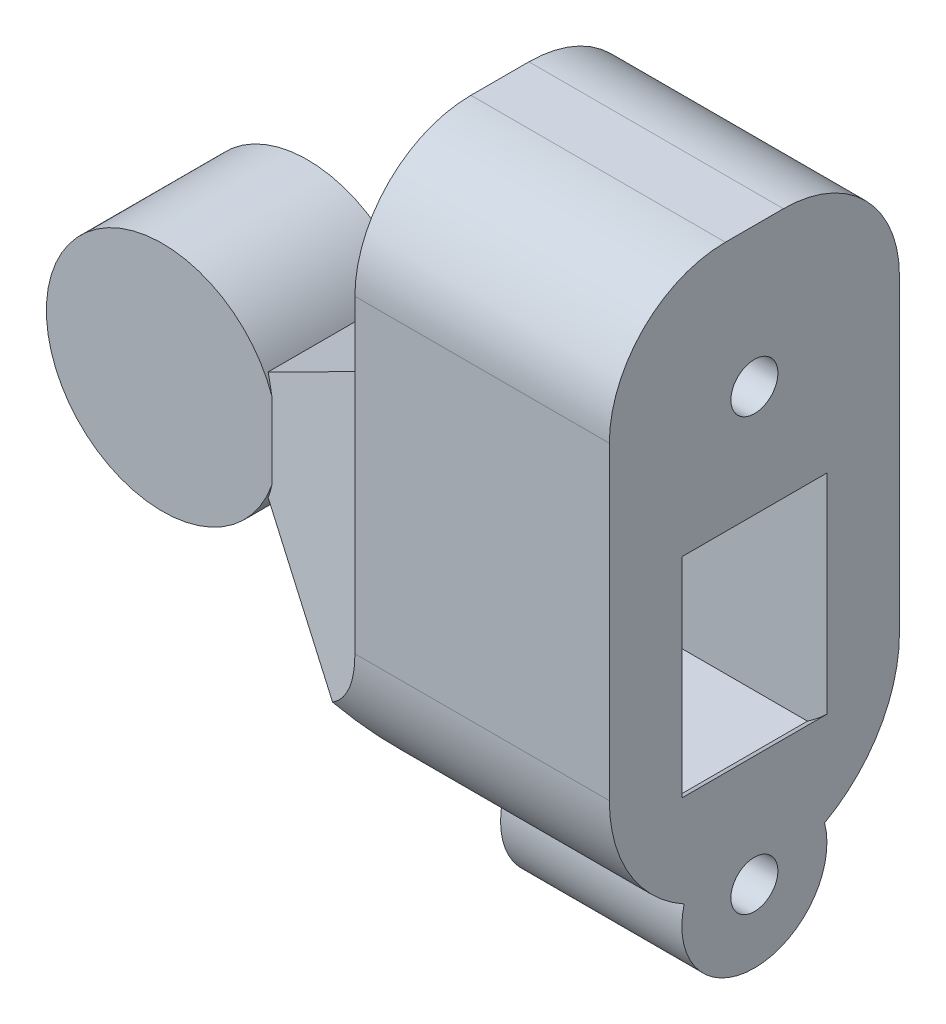
ISO-10303-21;
HEADER;
FILE_DESCRIPTION(('STEP AP214'),'2;1');
FILE_NAME('part.step','',(''),(''),'','','');
FILE_SCHEMA(('AUTOMOTIVE_DESIGN { 1 0 10303 214 1 1 1 1 }'));
ENDSEC;
DATA;
#1=APPLICATION_CONTEXT('core data for automotive mechanical design processes');
#2=APPLICATION_PROTOCOL_DEFINITION('international standard','automotive_design',2000,#1);
#3=PRODUCT_CONTEXT('',#1,'mechanical');
#4=PRODUCT('Part','Part','',(#3));
#5=PRODUCT_RELATED_PRODUCT_CATEGORY('part','',(#4));
#6=PRODUCT_DEFINITION_FORMATION('','',#4);
#7=PRODUCT_DEFINITION_CONTEXT('part definition',#1,'design');
#8=PRODUCT_DEFINITION('design','',#6,#7);
#9=PRODUCT_DEFINITION_SHAPE('','',#8);
#10=(LENGTH_UNIT() NAMED_UNIT(*) SI_UNIT(.MILLI.,.METRE.));
#11=(NAMED_UNIT(*) PLANE_ANGLE_UNIT() SI_UNIT($,.RADIAN.));
#12=(NAMED_UNIT(*) SI_UNIT($,.STERADIAN.) SOLID_ANGLE_UNIT());
#13=UNCERTAINTY_MEASURE_WITH_UNIT(LENGTH_MEASURE(1.E-05),#10,'distance_accuracy_value','');
#14=(GEOMETRIC_REPRESENTATION_CONTEXT(3) GLOBAL_UNCERTAINTY_ASSIGNED_CONTEXT((#13)) GLOBAL_UNIT_ASSIGNED_CONTEXT((#10,
#11,#12)) REPRESENTATION_CONTEXT('',''));
#15=CARTESIAN_POINT('',(0.,0.,0.));
#16=DIRECTION('',(0.,0.,1.));
#17=DIRECTION('',(1.,0.,0.));
#18=AXIS2_PLACEMENT_3D('',#15,#16,#17);
#19=CARTESIAN_POINT('',(22.7400393390537,-3.0875,3.175));
#20=DIRECTION('',(-1.,0.,0.));
#21=DIRECTION('',(0.,0.,1.));
#22=AXIS2_PLACEMENT_3D('',#19,#20,#21);
#23=CYLINDRICAL_SURFACE('',#22,6.35);
#24=CARTESIAN_POINT('',(5.448805756088,-3.0875,3.175));
#25=DIRECTION('',(-0.591996367950185,-0.805940630774866,0.));
#26=DIRECTION('',(-0.805940630774866,0.591996367950185,0.));
#27=AXIS2_PLACEMENT_3D('',#24,#25,#26);
#28=ELLIPSE('',#27,10.7264171602727,6.35);
#29=CARTESIAN_POINT('',(13.0130542416795,-8.64375,6.24918053105214));
#30=VERTEX_POINT('',#29);
#31=CARTESIAN_POINT('',(9.77315645377781,-6.26391251603598,8.6734455556066));
#32=VERTEX_POINT('',#31);
#33=EDGE_CURVE('E270',#30,#32,#28,.T.);
#34=ORIENTED_EDGE('',*,*,#33,.F.);
#35=DIRECTION('',(1.,0.,0.));
#36=VECTOR('',#35,1.);
#37=CARTESIAN_POINT('',(4.86126966952685,-8.64375,6.24918053105214));
#38=LINE('',#37,#36);
#39=CARTESIAN_POINT('',(14.8025393390537,-8.64375,6.24918053105214));
#40=VERTEX_POINT('',#39);
#41=EDGE_CURVE('E254',#30,#40,#38,.T.);
#42=ORIENTED_EDGE('',*,*,#41,.T.);
#43=DIRECTION('',(1.,0.,0.));
#44=VECTOR('',#43,1.);
#45=CARTESIAN_POINT('',(14.8025393390537,-8.64375,6.24918053105214));
#46=LINE('',#45,#44);
#47=CARTESIAN_POINT('',(22.7400393390537,-8.64375,6.24918053105214));
#48=VERTEX_POINT('',#47);
#49=EDGE_CURVE('E268',#40,#48,#46,.T.);
#50=ORIENTED_EDGE('',*,*,#49,.T.);
#51=CARTESIAN_POINT('',(22.7400393390537,-3.0875,3.175));
#52=DIRECTION('',(-1.,0.,0.));
#53=DIRECTION('',(0.,-1.,0.));
#54=AXIS2_PLACEMENT_3D('',#51,#52,#53);
#55=CIRCLE('',#54,6.35);
#56=CARTESIAN_POINT('',(22.7400393390537,-3.0875,9.525));
#57=VERTEX_POINT('',#56);
#58=EDGE_CURVE('E403',#57,#48,#55,.F.);
#59=ORIENTED_EDGE('',*,*,#58,.F.);
#60=DIRECTION('',(-1.,0.,0.));
#61=VECTOR('',#60,1.);
#62=CARTESIAN_POINT('',(0.,-3.0875,9.525));
#63=LINE('',#62,#61);
#64=CARTESIAN_POINT('',(11.5993208529701,-3.0875,9.525));
#65=VERTEX_POINT('',#64);
#66=EDGE_CURVE('E400',#65,#57,#63,.F.);
#67=ORIENTED_EDGE('',*,*,#66,.F.);
#68=CARTESIAN_POINT('',(-2.01829809226535,-3.0875,3.175));
#69=DIRECTION('',(-0.422618261740706,0.,0.906307787036647));
#70=DIRECTION('',(-0.906307787036647,0.,-0.422618261740706));
#71=AXIS2_PLACEMENT_3D('',#68,#69,#70);
#72=ELLIPSE('',#71,15.0253800530181,6.35);
#73=EDGE_CURVE('E432',#65,#32,#72,.F.);
#74=ORIENTED_EDGE('',*,*,#73,.T.);
#75=EDGE_LOOP('',(#34,#42,#50,#59,#67,#74));
#76=FACE_BOUND('',#75,.T.);
#77=ADVANCED_FACE('F92',(#76),#23,.T.);
#78=DIRECTION('',(1.,0.,0.));
#79=VECTOR('',#78,1.);
#80=CARTESIAN_POINT('',(14.8025393390537,-8.64375,0.100819468947865));
#81=LINE('',#80,#79);
#82=CARTESIAN_POINT('',(14.8025393390537,-8.64375,0.100819468947862));
#83=VERTEX_POINT('',#82);
#84=CARTESIAN_POINT('',(22.7400393390537,-8.64375,0.100819468947866));
#85=VERTEX_POINT('',#84);
#86=EDGE_CURVE('E277',#83,#85,#81,.T.);
#87=ORIENTED_EDGE('',*,*,#86,.F.);
#88=DIRECTION('',(1.,0.,0.));
#89=VECTOR('',#88,1.);
#90=CARTESIAN_POINT('',(4.86126966952685,-8.64375,0.100819468947865));
#91=LINE('',#90,#89);
#92=CARTESIAN_POINT('',(13.0130542416795,-8.64375,0.100819468947863));
#93=VERTEX_POINT('',#92);
#94=EDGE_CURVE('E257',#83,#93,#91,.F.);
#95=ORIENTED_EDGE('',*,*,#94,.T.);
#96=CARTESIAN_POINT('',(9.7731564537778,-6.26391251603598,-2.3234455556066));
#97=VERTEX_POINT('',#96);
#98=EDGE_CURVE('E397',#97,#93,#28,.T.);
#99=ORIENTED_EDGE('',*,*,#98,.F.);
#100=CARTESIAN_POINT('',(-2.01829809226537,-3.0875,3.175));
#101=DIRECTION('',(0.422618261740706,0.,0.906307787036647));
#102=DIRECTION('',(-0.906307787036647,0.,0.422618261740706));
#103=AXIS2_PLACEMENT_3D('',#100,#101,#102);
#104=ELLIPSE('',#103,15.0253800530181,6.35);
#105=CARTESIAN_POINT('',(11.5993208529701,-3.0875,-3.175));
#106=VERTEX_POINT('',#105);
#107=EDGE_CURVE('E430',#97,#106,#104,.T.);
#108=ORIENTED_EDGE('',*,*,#107,.T.);
#109=DIRECTION('',(1.,0.,0.));
#110=VECTOR('',#109,1.);
#111=CARTESIAN_POINT('',(22.7400393390537,-3.0875,-3.175));
#112=LINE('',#111,#110);
#113=CARTESIAN_POINT('',(22.7400393390537,-3.0875,-3.175));
#114=VERTEX_POINT('',#113);
#115=EDGE_CURVE('E394',#114,#106,#112,.F.);
#116=ORIENTED_EDGE('',*,*,#115,.F.);
#117=EDGE_CURVE('E402',#85,#114,#55,.F.);
#118=ORIENTED_EDGE('',*,*,#117,.F.);
#119=EDGE_LOOP('',(#87,#95,#99,#108,#116,#118));
#120=FACE_BOUND('',#119,.T.);
#121=ADVANCED_FACE('F466',(#120),#23,.T.);
#122=CARTESIAN_POINT('',(22.7400393390537,-9.4375,3.175));
#123=DIRECTION('',(1.,0.,0.));
#124=DIRECTION('',(0.,0.,-1.));
#125=AXIS2_PLACEMENT_3D('',#122,#123,#124);
#126=CYLINDRICAL_SURFACE('',#125,1.02869999999999);
#127=CARTESIAN_POINT('',(22.7400393390537,-9.4375,3.175));
#128=DIRECTION('',(1.,0.,0.));
#129=DIRECTION('',(0.,0.,-1.));
#130=AXIS2_PLACEMENT_3D('',#127,#128,#129);
#131=CIRCLE('',#130,1.02869999999999);
#132=CARTESIAN_POINT('',(22.7400393390537,-9.4375,2.14630000000001));
#133=VERTEX_POINT('',#132);
#134=EDGE_CURVE('E271',#133,#133,#131,.T.);
#135=ORIENTED_EDGE('',*,*,#134,.T.);
#136=EDGE_LOOP('',(#135));
#137=FACE_BOUND('',#136,.T.);
#138=CARTESIAN_POINT('',(14.8025393390537,-9.4375,3.175));
#139=DIRECTION('',(1.,0.,0.));
#140=DIRECTION('',(0.,1.,0.));
#141=AXIS2_PLACEMENT_3D('',#138,#139,#140);
#142=CIRCLE('',#141,1.02869999999999);
#143=CARTESIAN_POINT('',(14.8025393390537,-8.40880000000001,3.175));
#144=VERTEX_POINT('',#143);
#145=EDGE_CURVE('E282',#144,#144,#142,.T.);
#146=ORIENTED_EDGE('',*,*,#145,.F.);
#147=EDGE_LOOP('',(#146));
#148=FACE_BOUND('',#147,.T.);
#149=ADVANCED_FACE('F525',(#137,#148),#126,.F.);
#150=CARTESIAN_POINT('',(22.7400393390537,0.,-37.288896648468));
#151=DIRECTION('',(-1.,0.,0.));
#152=DIRECTION('',(0.,-1.,0.));
#153=AXIS2_PLACEMENT_3D('',#150,#151,#152);
#154=PLANE('',#153);
#155=ORIENTED_EDGE('',*,*,#134,.F.);
#156=EDGE_LOOP('',(#155));
#157=FACE_BOUND('',#156,.T.);
#158=CARTESIAN_POINT('',(22.7400393390537,9.43750000000001,3.175));
#159=DIRECTION('',(1.,0.,0.));
#160=DIRECTION('',(0.,0.,-1.));
#161=AXIS2_PLACEMENT_3D('',#158,#159,#160);
#162=CIRCLE('',#161,1.02869999999999);
#163=CARTESIAN_POINT('',(22.7400393390537,9.43750000000001,2.14630000000001));
#164=VERTEX_POINT('',#163);
#165=EDGE_CURVE('E287',#164,#164,#162,.T.);
#166=ORIENTED_EDGE('',*,*,#165,.F.);
#167=EDGE_LOOP('',(#166));
#168=FACE_BOUND('',#167,.T.);
#169=DIRECTION('',(0.,0.,1.));
#170=VECTOR('',#169,1.);
#171=CARTESIAN_POINT('',(22.7400393390537,15.5435647029378,-37.288896648468));
#172=LINE('',#171,#170);
#173=CARTESIAN_POINT('',(22.7400393390537,15.5435647029378,1.905));
#174=VERTEX_POINT('',#173);
#175=CARTESIAN_POINT('',(22.7400393390537,15.5435647029378,4.445));
#176=VERTEX_POINT('',#175);
#177=EDGE_CURVE('E377',#174,#176,#172,.T.);
#178=ORIENTED_EDGE('',*,*,#177,.T.);
#179=CARTESIAN_POINT('',(22.7400393390537,10.4635647029378,4.445));
#180=DIRECTION('',(-1.,0.,0.));
#181=DIRECTION('',(0.,-1.,0.));
#182=AXIS2_PLACEMENT_3D('',#179,#180,#181);
#183=CIRCLE('',#182,5.08);
#184=CARTESIAN_POINT('',(22.7400393390537,10.4635647029378,9.525));
#185=VERTEX_POINT('',#184);
#186=EDGE_CURVE('E413',#176,#185,#183,.F.);
#187=ORIENTED_EDGE('',*,*,#186,.T.);
#188=DIRECTION('',(0.,-1.,0.));
#189=VECTOR('',#188,1.);
#190=CARTESIAN_POINT('',(22.7400393390537,0.,9.525));
#191=LINE('',#190,#189);
#192=EDGE_CURVE('E345',#185,#57,#191,.T.);
#193=ORIENTED_EDGE('',*,*,#192,.T.);
#194=ORIENTED_EDGE('',*,*,#58,.T.);
#195=CARTESIAN_POINT('',(22.7400393390537,-9.4375,3.175));
#196=DIRECTION('',(1.,0.,0.));
#197=DIRECTION('',(0.,1.,0.));
#198=AXIS2_PLACEMENT_3D('',#195,#196,#197);
#199=CIRCLE('',#198,3.175);
#200=EDGE_CURVE('E107',#48,#85,#199,.T.);
#201=ORIENTED_EDGE('',*,*,#200,.T.);
#202=ORIENTED_EDGE('',*,*,#117,.T.);
#203=DIRECTION('',(0.,1.,0.));
#204=VECTOR('',#203,1.);
#205=CARTESIAN_POINT('',(22.7400393390537,0.,-3.175));
#206=LINE('',#205,#204);
#207=CARTESIAN_POINT('',(22.7400393390537,10.4635647029378,-3.175));
#208=VERTEX_POINT('',#207);
#209=EDGE_CURVE('E367',#114,#208,#206,.T.);
#210=ORIENTED_EDGE('',*,*,#209,.T.);
#211=CARTESIAN_POINT('',(22.7400393390537,10.4635647029378,1.905));
#212=DIRECTION('',(-1.,0.,0.));
#213=DIRECTION('',(0.,-1.,0.));
#214=AXIS2_PLACEMENT_3D('',#211,#212,#213);
#215=CIRCLE('',#214,5.08);
#216=EDGE_CURVE('E411',#208,#174,#215,.F.);
#217=ORIENTED_EDGE('',*,*,#216,.T.);
#218=EDGE_LOOP('',(#178,#187,#193,#194,#201,#202,#210,#217));
#219=FACE_BOUND('',#218,.T.);
#220=DIRECTION('',(0.,-1.,0.));
#221=VECTOR('',#220,1.);
#222=CARTESIAN_POINT('',(22.7400393390537,-4.572,6.35));
#223=LINE('',#222,#221);
#224=CARTESIAN_POINT('',(22.7400393390537,4.572,6.35));
#225=VERTEX_POINT('',#224);
#226=CARTESIAN_POINT('',(22.7400393390537,-4.572,6.35));
#227=VERTEX_POINT('',#226);
#228=EDGE_CURVE('E311',#225,#227,#223,.T.);
#229=ORIENTED_EDGE('',*,*,#228,.F.);
#230=DIRECTION('',(0.,0.,-1.));
#231=VECTOR('',#230,1.);
#232=CARTESIAN_POINT('',(22.7400393390537,4.572,6.35));
#233=LINE('',#232,#231);
#234=CARTESIAN_POINT('',(22.7400393390537,4.572,0.));
#235=VERTEX_POINT('',#234);
#236=EDGE_CURVE('E351',#225,#235,#233,.T.);
#237=ORIENTED_EDGE('',*,*,#236,.T.);
#238=DIRECTION('',(0.,-1.,0.));
#239=VECTOR('',#238,1.);
#240=CARTESIAN_POINT('',(22.7400393390537,-4.572,0.));
#241=LINE('',#240,#239);
#242=CARTESIAN_POINT('',(22.7400393390537,-4.572,0.));
#243=VERTEX_POINT('',#242);
#244=EDGE_CURVE('E335',#235,#243,#241,.T.);
#245=ORIENTED_EDGE('',*,*,#244,.T.);
#246=DIRECTION('',(0.,0.,-1.));
#247=VECTOR('',#246,1.);
#248=CARTESIAN_POINT('',(22.7400393390537,-4.572,6.35));
#249=LINE('',#248,#247);
#250=EDGE_CURVE('E348',#227,#243,#249,.T.);
#251=ORIENTED_EDGE('',*,*,#250,.F.);
#252=EDGE_LOOP('',(#229,#237,#245,#251));
#253=FACE_BOUND('',#252,.T.);
#254=ADVANCED_FACE('F475',(#157,#168,#219,#253),#154,.F.);
#255=CARTESIAN_POINT('',(0.,0.,6.35));
#256=DIRECTION('',(0.,0.,-1.));
#257=DIRECTION('',(-1.,0.,0.));
#258=AXIS2_PLACEMENT_3D('',#255,#256,#257);
#259=CYLINDRICAL_SURFACE('',#258,5.08);
#260=CARTESIAN_POINT('',(0.,0.,0.));
#261=DIRECTION('',(0.,0.,1.));
#262=DIRECTION('',(1.,0.,0.));
#263=AXIS2_PLACEMENT_3D('',#260,#261,#262);
#264=CIRCLE('',#263,5.08);
#265=CARTESIAN_POINT('',(4.79051138035236,1.69038478303447,0.));
#266=VERTEX_POINT('',#265);
#267=CARTESIAN_POINT('',(4.79051138035236,-1.69038478303447,0.));
#268=VERTEX_POINT('',#267);
#269=EDGE_CURVE('E114',#266,#268,#264,.T.);
#270=ORIENTED_EDGE('',*,*,#269,.T.);
#271=CARTESIAN_POINT('',(0.,0.,2.23385214313702));
#272=DIRECTION('',(0.422618261740706,0.,0.906307787036647));
#273=DIRECTION('',(0.906307787036647,0.,-0.422618261740706));
#274=AXIS2_PLACEMENT_3D('',#271,#272,#273);
#275=ELLIPSE('',#274,5.60515982832948,5.08);
#276=CARTESIAN_POINT('',(4.48732085297007,-2.38125,0.14138006479842));
#277=VERTEX_POINT('',#276);
#278=EDGE_CURVE('E100',#268,#277,#275,.F.);
#279=ORIENTED_EDGE('',*,*,#278,.T.);
#280=DIRECTION('',(0.,0.,-1.));
#281=VECTOR('',#280,1.);
#282=CARTESIAN_POINT('',(4.48732085297007,-2.38125,6.35));
#283=LINE('',#282,#281);
#284=CARTESIAN_POINT('',(4.48732085297007,-2.38125,6.20861993520157));
#285=VERTEX_POINT('',#284);
#286=EDGE_CURVE('E391',#285,#277,#283,.T.);
#287=ORIENTED_EDGE('',*,*,#286,.F.);
#288=CARTESIAN_POINT('',(0.,0.,4.11614785686297));
#289=DIRECTION('',(-0.422618261740706,0.,0.906307787036647));
#290=DIRECTION('',(-0.906307787036647,0.,-0.422618261740706));
#291=AXIS2_PLACEMENT_3D('',#288,#289,#290);
#292=ELLIPSE('',#291,5.60515982832948,5.08);
#293=CARTESIAN_POINT('',(4.79051138035237,-1.69038478303445,6.35));
#294=VERTEX_POINT('',#293);
#295=EDGE_CURVE('E446',#285,#294,#292,.T.);
#296=ORIENTED_EDGE('',*,*,#295,.T.);
#297=CARTESIAN_POINT('',(0.,0.,6.35));
#298=DIRECTION('',(0.,0.,1.));
#299=DIRECTION('',(1.,0.,0.));
#300=AXIS2_PLACEMENT_3D('',#297,#298,#299);
#301=CIRCLE('',#300,5.08);
#302=CARTESIAN_POINT('',(4.79051138035237,1.69038478303445,6.35));
#303=VERTEX_POINT('',#302);
#304=EDGE_CURVE('E385',#303,#294,#301,.T.);
#305=ORIENTED_EDGE('',*,*,#304,.F.);
#306=CARTESIAN_POINT('',(0.,0.,4.11614785686297));
#307=DIRECTION('',(-0.422618261740706,0.,0.906307787036647));
#308=DIRECTION('',(-0.906307787036647,0.,-0.422618261740706));
#309=AXIS2_PLACEMENT_3D('',#306,#307,#308);
#310=ELLIPSE('',#309,5.60515982832948,5.08);
#311=CARTESIAN_POINT('',(4.48732085297007,2.38125,6.20861993520157));
#312=VERTEX_POINT('',#311);
#313=EDGE_CURVE('E444',#303,#312,#310,.T.);
#314=ORIENTED_EDGE('',*,*,#313,.T.);
#315=DIRECTION('',(0.,0.,-1.));
#316=VECTOR('',#315,1.);
#317=CARTESIAN_POINT('',(4.48732085297007,2.38125,6.35));
#318=LINE('',#317,#316);
#319=CARTESIAN_POINT('',(4.48732085297007,2.38125,0.14138006479842));
#320=VERTEX_POINT('',#319);
#321=EDGE_CURVE('E387',#312,#320,#318,.T.);
#322=ORIENTED_EDGE('',*,*,#321,.T.);
#323=CARTESIAN_POINT('',(0.,0.,2.23385214313702));
#324=DIRECTION('',(0.422618261740706,0.,0.906307787036647));
#325=DIRECTION('',(0.906307787036647,0.,-0.422618261740706));
#326=AXIS2_PLACEMENT_3D('',#323,#324,#325);
#327=ELLIPSE('',#326,5.60515982832948,5.08);
#328=EDGE_CURVE('E13',#320,#266,#327,.F.);
#329=ORIENTED_EDGE('',*,*,#328,.T.);
#330=EDGE_LOOP('',(#270,#279,#287,#296,#305,#314,#322,#329));
#331=FACE_BOUND('',#330,.T.);
#332=ADVANCED_FACE('F453',(#331),#259,.T.);
#333=CARTESIAN_POINT('',(0.,0.,6.35));
#334=DIRECTION('',(0.,0.,1.));
#335=DIRECTION('',(1.,0.,0.));
#336=AXIS2_PLACEMENT_3D('',#333,#334,#335);
#337=PLANE('',#336);
#338=ORIENTED_EDGE('',*,*,#304,.T.);
#339=DIRECTION('',(0.,1.,0.));
#340=VECTOR('',#339,1.);
#341=CARTESIAN_POINT('',(4.79051138035237,0.,6.35));
#342=LINE('',#341,#340);
#343=EDGE_CURVE('E441',#294,#303,#342,.T.);
#344=ORIENTED_EDGE('',*,*,#343,.T.);
#345=EDGE_LOOP('',(#338,#344));
#346=FACE_BOUND('',#345,.T.);
#347=ADVANCED_FACE('F504',(#346),#337,.T.);
#348=CARTESIAN_POINT('',(0.,0.,0.));
#349=DIRECTION('',(0.,0.,1.));
#350=DIRECTION('',(1.,0.,0.));
#351=AXIS2_PLACEMENT_3D('',#348,#349,#350);
#352=PLANE('',#351);
#353=ORIENTED_EDGE('',*,*,#269,.F.);
#354=DIRECTION('',(0.,1.,0.));
#355=VECTOR('',#354,1.);
#356=CARTESIAN_POINT('',(4.79051138035236,0.,0.));
#357=LINE('',#356,#355);
#358=EDGE_CURVE('E449',#266,#268,#357,.F.);
#359=ORIENTED_EDGE('',*,*,#358,.T.);
#360=EDGE_LOOP('',(#353,#359));
#361=FACE_BOUND('',#360,.T.);
#362=ADVANCED_FACE('F510',(#361),#352,.F.);
#363=CARTESIAN_POINT('',(0.,0.,-3.175));
#364=DIRECTION('',(0.,0.,1.));
#365=DIRECTION('',(1.,0.,0.));
#366=AXIS2_PLACEMENT_3D('',#363,#364,#365);
#367=PLANE('',#366);
#368=ORIENTED_EDGE('',*,*,#115,.T.);
#369=DIRECTION('',(0.,1.,0.));
#370=VECTOR('',#369,1.);
#371=CARTESIAN_POINT('',(11.5993208529701,0.,-3.175));
#372=LINE('',#371,#370);
#373=CARTESIAN_POINT('',(11.5993208529701,7.60530498381908,-3.175));
#374=VERTEX_POINT('',#373);
#375=EDGE_CURVE('E438',#106,#374,#372,.T.);
#376=ORIENTED_EDGE('',*,*,#375,.T.);
#377=DIRECTION('',(-0.805940630774866,-0.591996367950185,0.));
#378=VECTOR('',#377,1.);
#379=CARTESIAN_POINT('',(0.436497581668821,-0.594245430119725,-3.175));
#380=LINE('',#379,#378);
#381=CARTESIAN_POINT('',(11.6003551304402,7.6060647029378,-3.175));
#382=VERTEX_POINT('',#381);
#383=EDGE_CURVE('E363',#382,#374,#380,.T.);
#384=ORIENTED_EDGE('',*,*,#383,.F.);
#385=DIRECTION('',(0.,-1.,0.));
#386=VECTOR('',#385,1.);
#387=CARTESIAN_POINT('',(11.6003551304402,0.,-3.175));
#388=LINE('',#387,#386);
#389=CARTESIAN_POINT('',(11.6003551304402,10.4635647029378,-3.175));
#390=VERTEX_POINT('',#389);
#391=EDGE_CURVE('E361',#390,#382,#388,.T.);
#392=ORIENTED_EDGE('',*,*,#391,.F.);
#393=DIRECTION('',(-1.,0.,0.));
#394=VECTOR('',#393,1.);
#395=CARTESIAN_POINT('',(0.,10.4635647029378,-3.175));
#396=LINE('',#395,#394);
#397=EDGE_CURVE('E421',#390,#208,#396,.F.);
#398=ORIENTED_EDGE('',*,*,#397,.T.);
#399=ORIENTED_EDGE('',*,*,#209,.F.);
#400=EDGE_LOOP('',(#368,#376,#384,#392,#398,#399));
#401=FACE_BOUND('',#400,.T.);
#402=ADVANCED_FACE('F470',(#401),#367,.F.);
#403=CARTESIAN_POINT('',(0.,15.5435647029378,-37.288896648468));
#404=DIRECTION('',(0.,-1.,0.));
#405=DIRECTION('',(1.,0.,0.));
#406=AXIS2_PLACEMENT_3D('',#403,#404,#405);
#407=PLANE('',#406);
#408=DIRECTION('',(0.,0.,1.));
#409=VECTOR('',#408,1.);
#410=CARTESIAN_POINT('',(11.6003551304402,15.5435647029378,-37.288896648468));
#411=LINE('',#410,#409);
#412=CARTESIAN_POINT('',(11.6003551304402,15.5435647029378,1.905));
#413=VERTEX_POINT('',#412);
#414=CARTESIAN_POINT('',(11.6003551304402,15.5435647029378,4.445));
#415=VERTEX_POINT('',#414);
#416=EDGE_CURVE('E380',#413,#415,#411,.T.);
#417=ORIENTED_EDGE('',*,*,#416,.T.);
#418=DIRECTION('',(1.,0.,0.));
#419=VECTOR('',#418,1.);
#420=CARTESIAN_POINT('',(22.7400393390537,15.5435647029378,4.445));
#421=LINE('',#420,#419);
#422=EDGE_CURVE('E408',#415,#176,#421,.T.);
#423=ORIENTED_EDGE('',*,*,#422,.T.);
#424=ORIENTED_EDGE('',*,*,#177,.F.);
#425=DIRECTION('',(-1.,0.,0.));
#426=VECTOR('',#425,1.);
#427=CARTESIAN_POINT('',(0.,15.5435647029378,1.905));
#428=LINE('',#427,#426);
#429=EDGE_CURVE('E405',#174,#413,#428,.T.);
#430=ORIENTED_EDGE('',*,*,#429,.T.);
#431=EDGE_LOOP('',(#417,#423,#424,#430));
#432=FACE_BOUND('',#431,.T.);
#433=ADVANCED_FACE('F483',(#432),#407,.F.);
#434=CARTESIAN_POINT('',(11.6003551304402,0.,-37.288896648468));
#435=DIRECTION('',(1.,0.,0.));
#436=DIRECTION('',(0.,1.,0.));
#437=AXIS2_PLACEMENT_3D('',#434,#435,#436);
#438=PLANE('',#437);
#439=CARTESIAN_POINT('',(11.6003551304402,9.43750000000001,3.175));
#440=DIRECTION('',(1.,0.,0.));
#441=DIRECTION('',(0.,1.,0.));
#442=AXIS2_PLACEMENT_3D('',#439,#440,#441);
#443=CIRCLE('',#442,1.02869999999999);
#444=CARTESIAN_POINT('',(11.6003551304402,10.4662,3.175));
#445=VERTEX_POINT('',#444);
#446=EDGE_CURVE('E291',#445,#445,#443,.T.);
#447=ORIENTED_EDGE('',*,*,#446,.T.);
#448=EDGE_LOOP('',(#447));
#449=FACE_BOUND('',#448,.T.);
#450=DIRECTION('',(0.,1.,0.));
#451=VECTOR('',#450,1.);
#452=CARTESIAN_POINT('',(11.6003551304402,0.,9.525));
#453=LINE('',#452,#451);
#454=CARTESIAN_POINT('',(11.6003551304402,7.6060647029378,9.525));
#455=VERTEX_POINT('',#454);
#456=CARTESIAN_POINT('',(11.6003551304402,10.4635647029378,9.525));
#457=VERTEX_POINT('',#456);
#458=EDGE_CURVE('E372',#455,#457,#453,.T.);
#459=ORIENTED_EDGE('',*,*,#458,.T.);
#460=CARTESIAN_POINT('',(11.6003551304402,10.4635647029378,4.445));
#461=DIRECTION('',(1.,0.,0.));
#462=DIRECTION('',(0.,1.,0.));
#463=AXIS2_PLACEMENT_3D('',#460,#461,#462);
#464=CIRCLE('',#463,5.08);
#465=EDGE_CURVE('E419',#457,#415,#464,.F.);
#466=ORIENTED_EDGE('',*,*,#465,.T.);
#467=ORIENTED_EDGE('',*,*,#416,.F.);
#468=CARTESIAN_POINT('',(11.6003551304402,10.4635647029378,1.905));
#469=DIRECTION('',(1.,0.,0.));
#470=DIRECTION('',(0.,1.,0.));
#471=AXIS2_PLACEMENT_3D('',#468,#469,#470);
#472=CIRCLE('',#471,5.08);
#473=EDGE_CURVE('E417',#413,#390,#472,.F.);
#474=ORIENTED_EDGE('',*,*,#473,.T.);
#475=ORIENTED_EDGE('',*,*,#391,.T.);
#476=DIRECTION('',(0.,0.,1.));
#477=VECTOR('',#476,1.);
#478=CARTESIAN_POINT('',(11.6003551304402,7.6060647029378,-37.288896648468));
#479=LINE('',#478,#477);
#480=EDGE_CURVE('E364',#382,#455,#479,.T.);
#481=ORIENTED_EDGE('',*,*,#480,.T.);
#482=EDGE_LOOP('',(#459,#466,#467,#474,#475,#481));
#483=FACE_BOUND('',#482,.T.);
#484=ADVANCED_FACE('F486',(#449,#483),#438,.F.);
#485=CARTESIAN_POINT('',(0.436497581668821,-0.594245430119725,-37.288896648468));
#486=DIRECTION('',(0.591996367950185,-0.805940630774866,0.));
#487=DIRECTION('',(0.805940630774866,0.591996367950185,0.));
#488=AXIS2_PLACEMENT_3D('',#485,#486,#487);
#489=PLANE('',#488);
#490=ORIENTED_EDGE('',*,*,#321,.F.);
#491=DIRECTION('',(0.754423071300368,0.554154612701739,0.351793255636183));
#492=VECTOR('',#491,1.);
#493=CARTESIAN_POINT('',(3.49179874995144,1.64999828405842,5.74440035470141));
#494=LINE('',#493,#492);
#495=CARTESIAN_POINT('',(11.5993208529701,7.60530498381908,9.525));
#496=VERTEX_POINT('',#495);
#497=EDGE_CURVE('E425',#312,#496,#494,.T.);
#498=ORIENTED_EDGE('',*,*,#497,.T.);
#499=DIRECTION('',(0.805940630774866,0.591996367950185,0.));
#500=VECTOR('',#499,1.);
#501=CARTESIAN_POINT('',(0.436497581668821,-0.594245430119725,9.525));
#502=LINE('',#501,#500);
#503=EDGE_CURVE('E375',#496,#455,#502,.T.);
#504=ORIENTED_EDGE('',*,*,#503,.T.);
#505=ORIENTED_EDGE('',*,*,#480,.F.);
#506=ORIENTED_EDGE('',*,*,#383,.T.);
#507=DIRECTION('',(0.754423071300368,0.554154612701739,-0.351793255636183));
#508=VECTOR('',#507,1.);
#509=CARTESIAN_POINT('',(3.49179874995144,1.64999828405842,0.605599645298584));
#510=LINE('',#509,#508);
#511=EDGE_CURVE('E423',#374,#320,#510,.F.);
#512=ORIENTED_EDGE('',*,*,#511,.T.);
#513=EDGE_LOOP('',(#490,#498,#504,#505,#506,#512));
#514=FACE_BOUND('',#513,.T.);
#515=ADVANCED_FACE('F507',(#514),#489,.F.);
#516=CARTESIAN_POINT('',(0.436497581668821,0.594245430119725,-37.288896648468));
#517=DIRECTION('',(-0.591996367950185,-0.805940630774866,0.));
#518=DIRECTION('',(0.805940630774866,-0.591996367950185,0.));
#519=AXIS2_PLACEMENT_3D('',#516,#517,#518);
#520=PLANE('',#519);
#521=ORIENTED_EDGE('',*,*,#98,.T.);
#522=CARTESIAN_POINT('',(14.0936611681926,-9.4375,3.175));
#523=DIRECTION('',(-0.591996367950185,-0.805940630774866,0.));
#524=DIRECTION('',(0.805940630774866,-0.591996367950185,0.));
#525=AXIS2_PLACEMENT_3D('',#522,#523,#524);
#526=ELLIPSE('',#525,5.36320858013637,3.175);
#527=EDGE_CURVE('E261',#93,#30,#526,.F.);
#528=ORIENTED_EDGE('',*,*,#527,.T.);
#529=ORIENTED_EDGE('',*,*,#33,.T.);
#530=DIRECTION('',(-0.754423071300368,0.554154612701739,-0.351793255636183));
#531=VECTOR('',#530,1.);
#532=CARTESIAN_POINT('',(-10.6064607814064,8.70575016475548,-0.829726031427586));
#533=LINE('',#532,#531);
#534=EDGE_CURVE('E436',#32,#285,#533,.T.);
#535=ORIENTED_EDGE('',*,*,#534,.T.);
#536=ORIENTED_EDGE('',*,*,#286,.T.);
#537=DIRECTION('',(-0.754423071300368,0.554154612701739,0.351793255636183));
#538=VECTOR('',#537,1.);
#539=CARTESIAN_POINT('',(10.8718523098852,-7.07094957492225,-2.83577584729266));
#540=LINE('',#539,#538);
#541=EDGE_CURVE('E434',#277,#97,#540,.F.);
#542=ORIENTED_EDGE('',*,*,#541,.T.);
#543=EDGE_LOOP('',(#521,#528,#529,#535,#536,#542));
#544=FACE_BOUND('',#543,.T.);
#545=ADVANCED_FACE('F459',(#544),#520,.T.);
#546=CARTESIAN_POINT('',(0.,0.,9.525));
#547=DIRECTION('',(0.,0.,1.));
#548=DIRECTION('',(1.,0.,0.));
#549=AXIS2_PLACEMENT_3D('',#546,#547,#548);
#550=PLANE('',#549);
#551=ORIENTED_EDGE('',*,*,#503,.F.);
#552=DIRECTION('',(0.,-1.,0.));
#553=VECTOR('',#552,1.);
#554=CARTESIAN_POINT('',(11.5993208529701,-2.38125,9.525));
#555=LINE('',#554,#553);
#556=EDGE_CURVE('E427',#496,#65,#555,.T.);
#557=ORIENTED_EDGE('',*,*,#556,.T.);
#558=ORIENTED_EDGE('',*,*,#66,.T.);
#559=ORIENTED_EDGE('',*,*,#192,.F.);
#560=DIRECTION('',(1.,0.,0.));
#561=VECTOR('',#560,1.);
#562=CARTESIAN_POINT('',(11.6003551304402,10.4635647029378,9.525));
#563=LINE('',#562,#561);
#564=EDGE_CURVE('E415',#185,#457,#563,.F.);
#565=ORIENTED_EDGE('',*,*,#564,.T.);
#566=ORIENTED_EDGE('',*,*,#458,.F.);
#567=EDGE_LOOP('',(#551,#557,#558,#559,#565,#566));
#568=FACE_BOUND('',#567,.T.);
#569=ADVANCED_FACE('F495',(#568),#550,.T.);
#570=CARTESIAN_POINT('',(18.3333040395377,0.,6.35));
#571=DIRECTION('',(0.,0.,-1.));
#572=DIRECTION('',(-1.,0.,0.));
#573=AXIS2_PLACEMENT_3D('',#570,#571,#572);
#574=CYLINDRICAL_SURFACE('',#573,6.35);
#575=CARTESIAN_POINT('',(18.3333040395377,0.,0.));
#576=DIRECTION('',(0.,0.,-1.));
#577=DIRECTION('',(-1.,0.,0.));
#578=AXIS2_PLACEMENT_3D('',#575,#576,#577);
#579=CIRCLE('',#578,6.35);
#580=CARTESIAN_POINT('',(14.7773040395377,-5.26092805501083,0.));
#581=VERTEX_POINT('',#580);
#582=CARTESIAN_POINT('',(12.8340427255066,-3.175,0.));
#583=VERTEX_POINT('',#582);
#584=EDGE_CURVE('E294',#581,#583,#579,.T.);
#585=ORIENTED_EDGE('',*,*,#584,.T.);
#586=DIRECTION('',(0.,0.,-1.));
#587=VECTOR('',#586,1.);
#588=CARTESIAN_POINT('',(12.8340427255066,-3.175,6.35));
#589=LINE('',#588,#587);
#590=CARTESIAN_POINT('',(12.8340427255066,-3.175,6.35));
#591=VERTEX_POINT('',#590);
#592=EDGE_CURVE('E320',#591,#583,#589,.T.);
#593=ORIENTED_EDGE('',*,*,#592,.F.);
#594=CARTESIAN_POINT('',(18.3333040395377,0.,6.35));
#595=DIRECTION('',(0.,0.,-1.));
#596=DIRECTION('',(-1.,0.,0.));
#597=AXIS2_PLACEMENT_3D('',#594,#595,#596);
#598=CIRCLE('',#597,6.35);
#599=CARTESIAN_POINT('',(14.7773040395377,-5.26092805501083,6.35));
#600=VERTEX_POINT('',#599);
#601=EDGE_CURVE('E295',#600,#591,#598,.T.);
#602=ORIENTED_EDGE('',*,*,#601,.F.);
#603=DIRECTION('',(0.,0.,-1.));
#604=VECTOR('',#603,1.);
#605=CARTESIAN_POINT('',(14.7773040395377,-5.26092805501083,6.35));
#606=LINE('',#605,#604);
#607=EDGE_CURVE('E343',#600,#581,#606,.T.);
#608=ORIENTED_EDGE('',*,*,#607,.T.);
#609=EDGE_LOOP('',(#585,#593,#602,#608));
#610=FACE_BOUND('',#609,.T.);
#611=ADVANCED_FACE('F564',(#610),#574,.F.);
#612=CARTESIAN_POINT('',(21.8893040395377,-5.26092805501083,6.35));
#613=DIRECTION('',(0.,-1.,0.));
#614=DIRECTION('',(0.,0.,-1.));
#615=AXIS2_PLACEMENT_3D('',#612,#613,#614);
#616=PLANE('',#615);
#617=DIRECTION('',(-1.,0.,0.));
#618=VECTOR('',#617,1.);
#619=CARTESIAN_POINT('',(21.8893040395377,-5.26092805501083,0.));
#620=LINE('',#619,#618);
#621=CARTESIAN_POINT('',(21.8893040395377,-5.26092805501083,0.));
#622=VERTEX_POINT('',#621);
#623=EDGE_CURVE('E299',#622,#581,#620,.T.);
#624=ORIENTED_EDGE('',*,*,#623,.T.);
#625=ORIENTED_EDGE('',*,*,#607,.F.);
#626=DIRECTION('',(-1.,0.,0.));
#627=VECTOR('',#626,1.);
#628=CARTESIAN_POINT('',(21.8893040395377,-5.26092805501083,6.35));
#629=LINE('',#628,#627);
#630=CARTESIAN_POINT('',(21.8893040395377,-5.26092805501083,6.35));
#631=VERTEX_POINT('',#630);
#632=EDGE_CURVE('E317',#631,#600,#629,.T.);
#633=ORIENTED_EDGE('',*,*,#632,.F.);
#634=DIRECTION('',(0.,0.,-1.));
#635=VECTOR('',#634,1.);
#636=CARTESIAN_POINT('',(21.8893040395377,-5.26092805501083,6.35));
#637=LINE('',#636,#635);
#638=EDGE_CURVE('E346',#631,#622,#637,.T.);
#639=ORIENTED_EDGE('',*,*,#638,.T.);
#640=EDGE_LOOP('',(#624,#625,#633,#639));
#641=FACE_BOUND('',#640,.T.);
#642=ADVANCED_FACE('F560',(#641),#616,.F.);
#643=CARTESIAN_POINT('',(18.3333040395377,0.,6.35));
#644=DIRECTION('',(0.,0.,-1.));
#645=DIRECTION('',(-1.,0.,0.));
#646=AXIS2_PLACEMENT_3D('',#643,#644,#645);
#647=CYLINDRICAL_SURFACE('',#646,6.35);
#648=CARTESIAN_POINT('',(18.3333040395377,0.,0.));
#649=DIRECTION('',(0.,0.,-1.));
#650=DIRECTION('',(-1.,0.,0.));
#651=AXIS2_PLACEMENT_3D('',#648,#649,#650);
#652=CIRCLE('',#651,6.35);
#653=EDGE_CURVE('E338',#243,#622,#652,.T.);
#654=ORIENTED_EDGE('',*,*,#653,.T.);
#655=ORIENTED_EDGE('',*,*,#638,.F.);
#656=CARTESIAN_POINT('',(18.3333040395377,0.,6.35));
#657=DIRECTION('',(0.,0.,-1.));
#658=DIRECTION('',(-1.,0.,0.));
#659=AXIS2_PLACEMENT_3D('',#656,#657,#658);
#660=CIRCLE('',#659,6.35);
#661=EDGE_CURVE('E314',#227,#631,#660,.T.);
#662=ORIENTED_EDGE('',*,*,#661,.F.);
#663=ORIENTED_EDGE('',*,*,#250,.T.);
#664=EDGE_LOOP('',(#654,#655,#662,#663));
#665=FACE_BOUND('',#664,.T.);
#666=ADVANCED_FACE('F563',(#665),#647,.F.);
#667=CARTESIAN_POINT('',(18.3333040395377,0.,6.35));
#668=DIRECTION('',(0.,0.,-1.));
#669=DIRECTION('',(-1.,0.,0.));
#670=AXIS2_PLACEMENT_3D('',#667,#668,#669);
#671=CYLINDRICAL_SURFACE('',#670,6.35);
#672=CARTESIAN_POINT('',(18.3333040395377,0.,0.));
#673=DIRECTION('',(0.,0.,-1.));
#674=DIRECTION('',(-1.,0.,0.));
#675=AXIS2_PLACEMENT_3D('',#672,#673,#674);
#676=CIRCLE('',#675,6.35);
#677=CARTESIAN_POINT('',(21.8893040395377,5.26092805501083,0.));
#678=VERTEX_POINT('',#677);
#679=EDGE_CURVE('E332',#678,#235,#676,.T.);
#680=ORIENTED_EDGE('',*,*,#679,.T.);
#681=ORIENTED_EDGE('',*,*,#236,.F.);
#682=CARTESIAN_POINT('',(18.3333040395377,0.,6.35));
#683=DIRECTION('',(0.,0.,-1.));
#684=DIRECTION('',(-1.,0.,0.));
#685=AXIS2_PLACEMENT_3D('',#682,#683,#684);
#686=CIRCLE('',#685,6.35);
#687=CARTESIAN_POINT('',(21.8893040395377,5.26092805501083,6.35));
#688=VERTEX_POINT('',#687);
#689=EDGE_CURVE('E308',#688,#225,#686,.T.);
#690=ORIENTED_EDGE('',*,*,#689,.F.);
#691=DIRECTION('',(0.,0.,-1.));
#692=VECTOR('',#691,1.);
#693=CARTESIAN_POINT('',(21.8893040395377,5.26092805501083,6.35));
#694=LINE('',#693,#692);
#695=EDGE_CURVE('E354',#688,#678,#694,.T.);
#696=ORIENTED_EDGE('',*,*,#695,.T.);
#697=EDGE_LOOP('',(#680,#681,#690,#696));
#698=FACE_BOUND('',#697,.T.);
#699=ADVANCED_FACE('F568',(#698),#671,.F.);
#700=CARTESIAN_POINT('',(14.7773040395377,5.26092805501083,6.35));
#701=DIRECTION('',(0.,1.,0.));
#702=DIRECTION('',(-1.,0.,0.));
#703=AXIS2_PLACEMENT_3D('',#700,#701,#702);
#704=PLANE('',#703);
#705=DIRECTION('',(1.,0.,0.));
#706=VECTOR('',#705,1.);
#707=CARTESIAN_POINT('',(14.7773040395377,5.26092805501083,0.));
#708=LINE('',#707,#706);
#709=CARTESIAN_POINT('',(14.7773040395377,5.26092805501083,0.));
#710=VERTEX_POINT('',#709);
#711=EDGE_CURVE('E329',#710,#678,#708,.T.);
#712=ORIENTED_EDGE('',*,*,#711,.T.);
#713=ORIENTED_EDGE('',*,*,#695,.F.);
#714=DIRECTION('',(1.,0.,0.));
#715=VECTOR('',#714,1.);
#716=CARTESIAN_POINT('',(14.7773040395377,5.26092805501083,6.35));
#717=LINE('',#716,#715);
#718=CARTESIAN_POINT('',(14.7773040395377,5.26092805501083,6.35));
#719=VERTEX_POINT('',#718);
#720=EDGE_CURVE('E305',#719,#688,#717,.T.);
#721=ORIENTED_EDGE('',*,*,#720,.F.);
#722=DIRECTION('',(0.,0.,-1.));
#723=VECTOR('',#722,1.);
#724=CARTESIAN_POINT('',(14.7773040395377,5.26092805501083,6.35));
#725=LINE('',#724,#723);
#726=EDGE_CURVE('E356',#719,#710,#725,.T.);
#727=ORIENTED_EDGE('',*,*,#726,.T.);
#728=EDGE_LOOP('',(#712,#713,#721,#727));
#729=FACE_BOUND('',#728,.T.);
#730=ADVANCED_FACE('F572',(#729),#704,.F.);
#731=CARTESIAN_POINT('',(18.3333040395377,0.,6.35));
#732=DIRECTION('',(0.,0.,-1.));
#733=DIRECTION('',(-1.,0.,0.));
#734=AXIS2_PLACEMENT_3D('',#731,#732,#733);
#735=CYLINDRICAL_SURFACE('',#734,6.35);
#736=CARTESIAN_POINT('',(18.3333040395377,0.,0.));
#737=DIRECTION('',(0.,0.,-1.));
#738=DIRECTION('',(-1.,0.,0.));
#739=AXIS2_PLACEMENT_3D('',#736,#737,#738);
#740=CIRCLE('',#739,6.35);
#741=CARTESIAN_POINT('',(12.8340427255066,3.175,0.));
#742=VERTEX_POINT('',#741);
#743=EDGE_CURVE('E326',#742,#710,#740,.T.);
#744=ORIENTED_EDGE('',*,*,#743,.T.);
#745=ORIENTED_EDGE('',*,*,#726,.F.);
#746=CARTESIAN_POINT('',(18.3333040395377,0.,6.35));
#747=DIRECTION('',(0.,0.,-1.));
#748=DIRECTION('',(-1.,0.,0.));
#749=AXIS2_PLACEMENT_3D('',#746,#747,#748);
#750=CIRCLE('',#749,6.35);
#751=CARTESIAN_POINT('',(12.8340427255066,3.175,6.35));
#752=VERTEX_POINT('',#751);
#753=EDGE_CURVE('E302',#752,#719,#750,.T.);
#754=ORIENTED_EDGE('',*,*,#753,.F.);
#755=DIRECTION('',(0.,0.,-1.));
#756=VECTOR('',#755,1.);
#757=CARTESIAN_POINT('',(12.8340427255066,3.175,6.35));
#758=LINE('',#757,#756);
#759=EDGE_CURVE('E358',#752,#742,#758,.T.);
#760=ORIENTED_EDGE('',*,*,#759,.T.);
#761=EDGE_LOOP('',(#744,#745,#754,#760));
#762=FACE_BOUND('',#761,.T.);
#763=ADVANCED_FACE('F576',(#762),#735,.F.);
#764=CARTESIAN_POINT('',(12.8340427255066,-3.175,6.35));
#765=DIRECTION('',(-1.,0.,0.));
#766=DIRECTION('',(0.,0.,1.));
#767=AXIS2_PLACEMENT_3D('',#764,#765,#766);
#768=PLANE('',#767);
#769=DIRECTION('',(0.,1.,0.));
#770=VECTOR('',#769,1.);
#771=CARTESIAN_POINT('',(12.8340427255066,-3.175,0.));
#772=LINE('',#771,#770);
#773=EDGE_CURVE('E323',#583,#742,#772,.T.);
#774=ORIENTED_EDGE('',*,*,#773,.T.);
#775=ORIENTED_EDGE('',*,*,#759,.F.);
#776=DIRECTION('',(0.,1.,0.));
#777=VECTOR('',#776,1.);
#778=CARTESIAN_POINT('',(12.8340427255066,-3.175,6.35));
#779=LINE('',#778,#777);
#780=EDGE_CURVE('E298',#591,#752,#779,.T.);
#781=ORIENTED_EDGE('',*,*,#780,.F.);
#782=ORIENTED_EDGE('',*,*,#592,.T.);
#783=EDGE_LOOP('',(#774,#775,#781,#782));
#784=FACE_BOUND('',#783,.T.);
#785=ADVANCED_FACE('F555',(#784),#768,.F.);
#786=CARTESIAN_POINT('',(18.3333040395377,0.,6.35));
#787=DIRECTION('',(0.,0.,-1.));
#788=DIRECTION('',(-1.,0.,0.));
#789=AXIS2_PLACEMENT_3D('',#786,#787,#788);
#790=PLANE('',#789);
#791=ORIENTED_EDGE('',*,*,#601,.T.);
#792=ORIENTED_EDGE('',*,*,#780,.T.);
#793=ORIENTED_EDGE('',*,*,#753,.T.);
#794=ORIENTED_EDGE('',*,*,#720,.T.);
#795=ORIENTED_EDGE('',*,*,#689,.T.);
#796=ORIENTED_EDGE('',*,*,#228,.T.);
#797=ORIENTED_EDGE('',*,*,#661,.T.);
#798=ORIENTED_EDGE('',*,*,#632,.T.);
#799=EDGE_LOOP('',(#791,#792,#793,#794,#795,#796,#797,#798));
#800=FACE_BOUND('',#799,.T.);
#801=ADVANCED_FACE('F552',(#800),#790,.T.);
#802=CARTESIAN_POINT('',(18.3333040395377,0.,0.));
#803=DIRECTION('',(0.,0.,-1.));
#804=DIRECTION('',(-1.,0.,0.));
#805=AXIS2_PLACEMENT_3D('',#802,#803,#804);
#806=PLANE('',#805);
#807=ORIENTED_EDGE('',*,*,#584,.F.);
#808=ORIENTED_EDGE('',*,*,#623,.F.);
#809=ORIENTED_EDGE('',*,*,#653,.F.);
#810=ORIENTED_EDGE('',*,*,#244,.F.);
#811=ORIENTED_EDGE('',*,*,#679,.F.);
#812=ORIENTED_EDGE('',*,*,#711,.F.);
#813=ORIENTED_EDGE('',*,*,#743,.F.);
#814=ORIENTED_EDGE('',*,*,#773,.F.);
#815=EDGE_LOOP('',(#807,#808,#809,#810,#811,#812,#813,#814));
#816=FACE_BOUND('',#815,.T.);
#817=ADVANCED_FACE('F550',(#816),#806,.F.);
#818=CARTESIAN_POINT('',(22.7400393390537,9.43750000000001,3.175));
#819=DIRECTION('',(1.,0.,0.));
#820=DIRECTION('',(0.,0.,-1.));
#821=AXIS2_PLACEMENT_3D('',#818,#819,#820);
#822=CYLINDRICAL_SURFACE('',#821,1.02869999999999);
#823=ORIENTED_EDGE('',*,*,#165,.T.);
#824=EDGE_LOOP('',(#823));
#825=FACE_BOUND('',#824,.T.);
#826=ORIENTED_EDGE('',*,*,#446,.F.);
#827=EDGE_LOOP('',(#826));
#828=FACE_BOUND('',#827,.T.);
#829=ADVANCED_FACE('F532',(#825,#828),#822,.F.);
#830=CARTESIAN_POINT('',(0.,10.4635647029378,4.445));
#831=DIRECTION('',(-1.,0.,0.));
#832=DIRECTION('',(0.,-1.,0.));
#833=AXIS2_PLACEMENT_3D('',#830,#831,#832);
#834=CYLINDRICAL_SURFACE('',#833,5.08);
#835=ORIENTED_EDGE('',*,*,#465,.F.);
#836=ORIENTED_EDGE('',*,*,#564,.F.);
#837=ORIENTED_EDGE('',*,*,#186,.F.);
#838=ORIENTED_EDGE('',*,*,#422,.F.);
#839=EDGE_LOOP('',(#835,#836,#837,#838));
#840=FACE_BOUND('',#839,.T.);
#841=ADVANCED_FACE('F491',(#840),#834,.T.);
#842=CARTESIAN_POINT('',(0.,10.4635647029378,1.905));
#843=DIRECTION('',(-1.,0.,0.));
#844=DIRECTION('',(0.,-1.,0.));
#845=AXIS2_PLACEMENT_3D('',#842,#843,#844);
#846=CYLINDRICAL_SURFACE('',#845,5.08);
#847=ORIENTED_EDGE('',*,*,#216,.F.);
#848=ORIENTED_EDGE('',*,*,#397,.F.);
#849=ORIENTED_EDGE('',*,*,#473,.F.);
#850=ORIENTED_EDGE('',*,*,#429,.F.);
#851=EDGE_LOOP('',(#847,#848,#849,#850));
#852=FACE_BOUND('',#851,.T.);
#853=ADVANCED_FACE('F480',(#852),#846,.T.);
#854=CARTESIAN_POINT('',(4.48732085297007,0.,6.20861993520157));
#855=DIRECTION('',(-0.422618261740706,0.,0.906307787036647));
#856=DIRECTION('',(0.,-1.,0.));
#857=AXIS2_PLACEMENT_3D('',#854,#855,#856);
#858=PLANE('',#857);
#859=ORIENTED_EDGE('',*,*,#73,.F.);
#860=ORIENTED_EDGE('',*,*,#556,.F.);
#861=ORIENTED_EDGE('',*,*,#497,.F.);
#862=ORIENTED_EDGE('',*,*,#313,.F.);
#863=ORIENTED_EDGE('',*,*,#343,.F.);
#864=ORIENTED_EDGE('',*,*,#295,.F.);
#865=ORIENTED_EDGE('',*,*,#534,.F.);
#866=EDGE_LOOP('',(#859,#860,#861,#862,#863,#864,#865));
#867=FACE_BOUND('',#866,.T.);
#868=ADVANCED_FACE('F499',(#867),#858,.T.);
#869=CARTESIAN_POINT('',(4.48732085297007,0.,0.14138006479842));
#870=DIRECTION('',(0.422618261740706,0.,0.906307787036647));
#871=DIRECTION('',(0.,-1.,0.));
#872=AXIS2_PLACEMENT_3D('',#869,#870,#871);
#873=PLANE('',#872);
#874=ORIENTED_EDGE('',*,*,#511,.F.);
#875=ORIENTED_EDGE('',*,*,#375,.F.);
#876=ORIENTED_EDGE('',*,*,#107,.F.);
#877=ORIENTED_EDGE('',*,*,#541,.F.);
#878=ORIENTED_EDGE('',*,*,#278,.F.);
#879=ORIENTED_EDGE('',*,*,#358,.F.);
#880=ORIENTED_EDGE('',*,*,#328,.F.);
#881=EDGE_LOOP('',(#874,#875,#876,#877,#878,#879,#880));
#882=FACE_BOUND('',#881,.T.);
#883=ADVANCED_FACE('F94',(#882),#873,.F.);
#884=CARTESIAN_POINT('',(14.8025393390537,-9.4375,3.175));
#885=DIRECTION('',(1.,0.,0.));
#886=DIRECTION('',(0.,1.,0.));
#887=AXIS2_PLACEMENT_3D('',#884,#885,#886);
#888=CYLINDRICAL_SURFACE('',#887,3.175);
#889=ORIENTED_EDGE('',*,*,#200,.F.);
#890=ORIENTED_EDGE('',*,*,#49,.F.);
#891=CARTESIAN_POINT('',(14.8025393390537,-9.4375,3.175));
#892=DIRECTION('',(1.,0.,0.));
#893=DIRECTION('',(0.,1.,0.));
#894=AXIS2_PLACEMENT_3D('',#891,#892,#893);
#895=CIRCLE('',#894,3.175);
#896=EDGE_CURVE('E275',#40,#83,#895,.T.);
#897=ORIENTED_EDGE('',*,*,#896,.T.);
#898=ORIENTED_EDGE('',*,*,#86,.T.);
#899=EDGE_LOOP('',(#889,#890,#897,#898));
#900=FACE_BOUND('',#899,.T.);
#901=ADVANCED_FACE('F274',(#900),#888,.T.);
#902=CARTESIAN_POINT('',(14.8025393390537,-6.2625,3.175));
#903=DIRECTION('',(1.,0.,0.));
#904=DIRECTION('',(0.,1.,0.));
#905=AXIS2_PLACEMENT_3D('',#902,#903,#904);
#906=PLANE('',#905);
#907=ORIENTED_EDGE('',*,*,#896,.F.);
#908=CARTESIAN_POINT('',(14.8025393390537,-9.4375,3.175));
#909=DIRECTION('',(-1.,0.,0.));
#910=DIRECTION('',(0.,-1.,0.));
#911=AXIS2_PLACEMENT_3D('',#908,#909,#910);
#912=CIRCLE('',#911,3.175);
#913=EDGE_CURVE('E251',#40,#83,#912,.T.);
#914=ORIENTED_EDGE('',*,*,#913,.T.);
#915=EDGE_LOOP('',(#907,#914));
#916=FACE_BOUND('',#915,.T.);
#917=ORIENTED_EDGE('',*,*,#145,.T.);
#918=EDGE_LOOP('',(#917));
#919=FACE_BOUND('',#918,.T.);
#920=ADVANCED_FACE('F279',(#916,#919),#906,.F.);
#921=CARTESIAN_POINT('',(-5.08,-9.43750000000001,3.175));
#922=DIRECTION('',(1.,0.,0.));
#923=DIRECTION('',(0.,1.,0.));
#924=AXIS2_PLACEMENT_3D('',#921,#922,#923);
#925=CYLINDRICAL_SURFACE('',#924,3.175);
#926=ORIENTED_EDGE('',*,*,#527,.F.);
#927=ORIENTED_EDGE('',*,*,#94,.F.);
#928=ORIENTED_EDGE('',*,*,#913,.F.);
#929=ORIENTED_EDGE('',*,*,#41,.F.);
#930=EDGE_LOOP('',(#926,#927,#928,#929));
#931=FACE_BOUND('',#930,.T.);
#932=ADVANCED_FACE('F253',(#931),#925,.F.);
#933=CLOSED_SHELL('',(#77,#121,#149,#254,#332,#347,#362,#402,#433,#484,#515,#545,#569,#611,#642,
#666,#699,#730,#763,#785,#801,#817,#829,#841,#853,#868,#883,#901,#920,#932));
#934=MANIFOLD_SOLID_BREP('B2',#933);
#935=ADVANCED_BREP_SHAPE_REPRESENTATION('',(#18,#934),#14);
#936=SHAPE_DEFINITION_REPRESENTATION(#9,#935);
ENDSEC;
END-ISO-10303-21;
